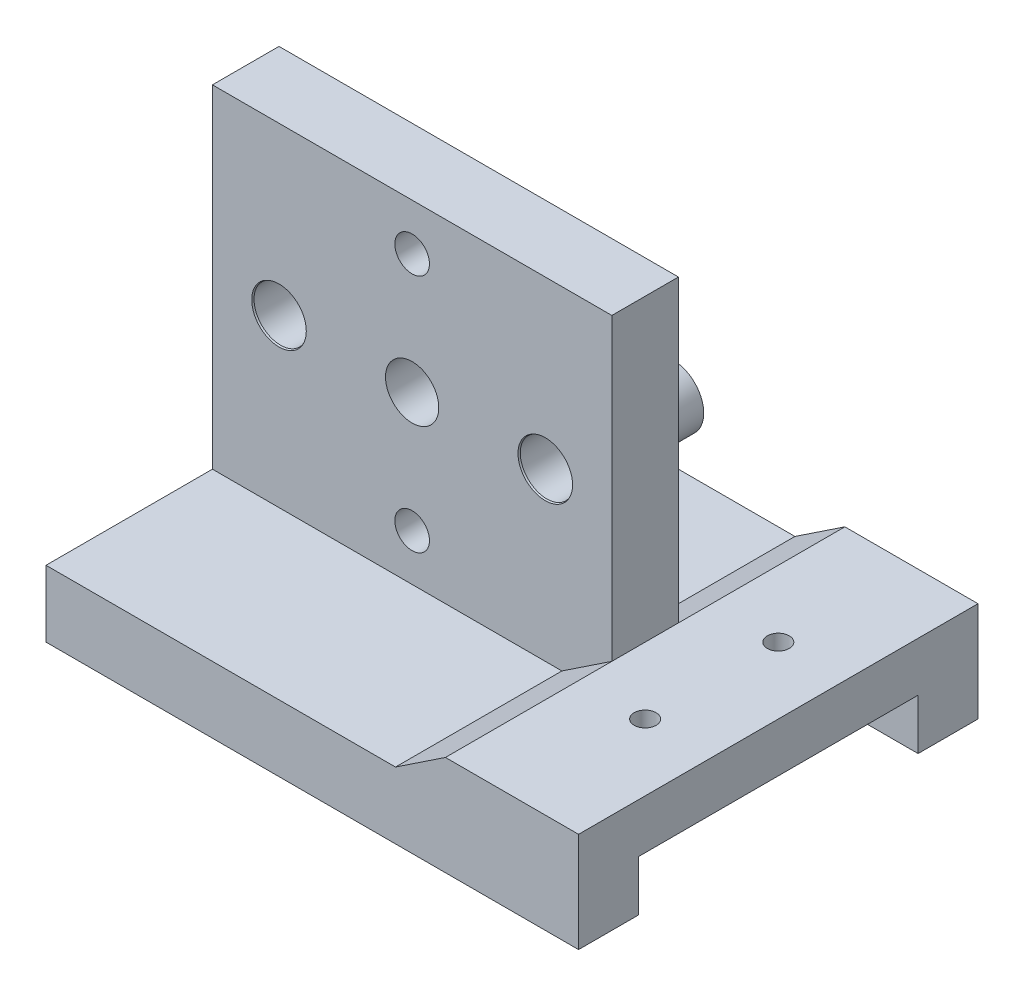
ISO-10303-21;
HEADER;
FILE_DESCRIPTION(('STEP AP214'),'2;1');
FILE_NAME('part.step','',(''),(''),'','','');
FILE_SCHEMA(('AUTOMOTIVE_DESIGN { 1 0 10303 214 1 1 1 1 }'));
ENDSEC;
DATA;
#1=APPLICATION_CONTEXT('core data for automotive mechanical design processes');
#2=APPLICATION_PROTOCOL_DEFINITION('international standard','automotive_design',2000,#1);
#3=PRODUCT_CONTEXT('',#1,'mechanical');
#4=PRODUCT('Part','Part','',(#3));
#5=PRODUCT_RELATED_PRODUCT_CATEGORY('part','',(#4));
#6=PRODUCT_DEFINITION_FORMATION('','',#4);
#7=PRODUCT_DEFINITION_CONTEXT('part definition',#1,'design');
#8=PRODUCT_DEFINITION('design','',#6,#7);
#9=PRODUCT_DEFINITION_SHAPE('','',#8);
#10=(LENGTH_UNIT() NAMED_UNIT(*) SI_UNIT(.MILLI.,.METRE.));
#11=(NAMED_UNIT(*) PLANE_ANGLE_UNIT() SI_UNIT($,.RADIAN.));
#12=(NAMED_UNIT(*) SI_UNIT($,.STERADIAN.) SOLID_ANGLE_UNIT());
#13=UNCERTAINTY_MEASURE_WITH_UNIT(LENGTH_MEASURE(1.E-05),#10,'distance_accuracy_value','');
#14=(GEOMETRIC_REPRESENTATION_CONTEXT(3) GLOBAL_UNCERTAINTY_ASSIGNED_CONTEXT((#13)) GLOBAL_UNIT_ASSIGNED_CONTEXT((#10,
#11,#12)) REPRESENTATION_CONTEXT('',''));
#15=CARTESIAN_POINT('',(0.,0.,0.));
#16=DIRECTION('',(0.,0.,1.));
#17=DIRECTION('',(1.,0.,0.));
#18=AXIS2_PLACEMENT_3D('',#15,#16,#17);
#19=CARTESIAN_POINT('',(0.,0.,0.));
#20=DIRECTION('',(0.,0.,-1.));
#21=DIRECTION('',(-1.,0.,0.));
#22=AXIS2_PLACEMENT_3D('',#19,#20,#21);
#23=PLANE('',#22);
#24=CARTESIAN_POINT('',(20.,0.,0.));
#25=DIRECTION('',(0.,0.,-1.));
#26=DIRECTION('',(-1.,0.,0.));
#27=AXIS2_PLACEMENT_3D('',#24,#25,#26);
#28=CIRCLE('',#27,4.6);
#29=CARTESIAN_POINT('',(15.4,0.,0.));
#30=VERTEX_POINT('',#29);
#31=EDGE_CURVE('E246',#30,#30,#28,.T.);
#32=ORIENTED_EDGE('',*,*,#31,.F.);
#33=EDGE_LOOP('',(#32));
#34=FACE_BOUND('',#33,.T.);
#35=CARTESIAN_POINT('',(0.,0.,0.));
#36=DIRECTION('',(0.,0.,-1.));
#37=DIRECTION('',(-1.,0.,0.));
#38=AXIS2_PLACEMENT_3D('',#35,#36,#37);
#39=CIRCLE('',#38,4.25);
#40=CARTESIAN_POINT('',(-4.25,0.,0.));
#41=VERTEX_POINT('',#40);
#42=EDGE_CURVE('E233',#41,#41,#39,.T.);
#43=ORIENTED_EDGE('',*,*,#42,.F.);
#44=EDGE_LOOP('',(#43));
#45=FACE_BOUND('',#44,.T.);
#46=DIRECTION('',(0.832050294337844,0.554700196225229,0.));
#47=VECTOR('',#46,1.);
#48=CARTESIAN_POINT('',(18.4615384615385,-27.6923076923077,0.));
#49=LINE('',#48,#47);
#50=CARTESIAN_POINT('',(22.4999999999999,-25.,0.));
#51=VERTEX_POINT('',#50);
#52=CARTESIAN_POINT('',(30.,-20.,0.));
#53=VERTEX_POINT('',#52);
#54=EDGE_CURVE('E66',#51,#53,#49,.T.);
#55=ORIENTED_EDGE('',*,*,#54,.F.);
#56=DIRECTION('',(1.,0.,0.));
#57=VECTOR('',#56,1.);
#58=CARTESIAN_POINT('',(-30.,-25.,0.));
#59=LINE('',#58,#57);
#60=CARTESIAN_POINT('',(-30.,-25.,0.));
#61=VERTEX_POINT('',#60);
#62=EDGE_CURVE('E160',#61,#51,#59,.T.);
#63=ORIENTED_EDGE('',*,*,#62,.F.);
#64=DIRECTION('',(0.,-1.,0.));
#65=VECTOR('',#64,1.);
#66=CARTESIAN_POINT('',(-30.,-25.,0.));
#67=LINE('',#66,#65);
#68=CARTESIAN_POINT('',(-30.,25.,0.));
#69=VERTEX_POINT('',#68);
#70=EDGE_CURVE('E329',#69,#61,#67,.T.);
#71=ORIENTED_EDGE('',*,*,#70,.F.);
#72=DIRECTION('',(-1.,0.,0.));
#73=VECTOR('',#72,1.);
#74=CARTESIAN_POINT('',(-30.,25.,0.));
#75=LINE('',#74,#73);
#76=CARTESIAN_POINT('',(30.,25.,0.));
#77=VERTEX_POINT('',#76);
#78=EDGE_CURVE('E324',#77,#69,#75,.T.);
#79=ORIENTED_EDGE('',*,*,#78,.F.);
#80=DIRECTION('',(0.,1.,0.));
#81=VECTOR('',#80,1.);
#82=CARTESIAN_POINT('',(30.,-25.,0.));
#83=LINE('',#82,#81);
#84=EDGE_CURVE('E330',#53,#77,#83,.T.);
#85=ORIENTED_EDGE('',*,*,#84,.F.);
#86=EDGE_LOOP('',(#55,#63,#71,#79,#85));
#87=FACE_BOUND('',#86,.T.);
#88=CARTESIAN_POINT('',(0.,18.,0.));
#89=DIRECTION('',(0.,0.,-1.));
#90=DIRECTION('',(-1.,0.,0.));
#91=AXIS2_PLACEMENT_3D('',#88,#89,#90);
#92=CIRCLE('',#91,2.60000000000001);
#93=CARTESIAN_POINT('',(-2.60000000000001,18.,0.));
#94=VERTEX_POINT('',#93);
#95=EDGE_CURVE('E379',#94,#94,#92,.T.);
#96=ORIENTED_EDGE('',*,*,#95,.F.);
#97=EDGE_LOOP('',(#96));
#98=FACE_BOUND('',#97,.T.);
#99=CARTESIAN_POINT('',(0.,-18.,0.));
#100=DIRECTION('',(0.,0.,-1.));
#101=DIRECTION('',(-1.,0.,0.));
#102=AXIS2_PLACEMENT_3D('',#99,#100,#101);
#103=CIRCLE('',#102,2.60000000000001);
#104=CARTESIAN_POINT('',(-2.60000000000001,-18.,0.));
#105=VERTEX_POINT('',#104);
#106=EDGE_CURVE('E371',#105,#105,#103,.T.);
#107=ORIENTED_EDGE('',*,*,#106,.F.);
#108=EDGE_LOOP('',(#107));
#109=FACE_BOUND('',#108,.T.);
#110=CARTESIAN_POINT('',(-20.,0.,0.));
#111=DIRECTION('',(0.,0.,-1.));
#112=DIRECTION('',(-1.,0.,0.));
#113=AXIS2_PLACEMENT_3D('',#110,#111,#112);
#114=CIRCLE('',#113,4.6);
#115=CARTESIAN_POINT('',(-24.6,0.,0.));
#116=VERTEX_POINT('',#115);
#117=EDGE_CURVE('E262',#116,#116,#114,.T.);
#118=ORIENTED_EDGE('',*,*,#117,.F.);
#119=EDGE_LOOP('',(#118));
#120=FACE_BOUND('',#119,.T.);
#121=ADVANCED_FACE('F41',(#34,#45,#87,#98,#109,#120),#23,.T.);
#122=CARTESIAN_POINT('',(30.,-25.,10.));
#123=DIRECTION('',(-1.,0.,0.));
#124=DIRECTION('',(0.,0.,1.));
#125=AXIS2_PLACEMENT_3D('',#122,#123,#124);
#126=PLANE('',#125);
#127=DIRECTION('',(0.,0.,-1.));
#128=VECTOR('',#127,1.);
#129=CARTESIAN_POINT('',(30.,-20.,35.));
#130=LINE('',#129,#128);
#131=CARTESIAN_POINT('',(30.,-20.,10.));
#132=VERTEX_POINT('',#131);
#133=EDGE_CURVE('E154',#132,#53,#130,.T.);
#134=ORIENTED_EDGE('',*,*,#133,.T.);
#135=ORIENTED_EDGE('',*,*,#84,.T.);
#136=DIRECTION('',(0.,0.,-1.));
#137=VECTOR('',#136,1.);
#138=CARTESIAN_POINT('',(30.,25.,10.));
#139=LINE('',#138,#137);
#140=CARTESIAN_POINT('',(30.,25.,10.));
#141=VERTEX_POINT('',#140);
#142=EDGE_CURVE('E11',#141,#77,#139,.T.);
#143=ORIENTED_EDGE('',*,*,#142,.F.);
#144=DIRECTION('',(0.,1.,0.));
#145=VECTOR('',#144,1.);
#146=CARTESIAN_POINT('',(30.,-25.,10.));
#147=LINE('',#146,#145);
#148=EDGE_CURVE('E152',#132,#141,#147,.T.);
#149=ORIENTED_EDGE('',*,*,#148,.F.);
#150=EDGE_LOOP('',(#134,#135,#143,#149));
#151=FACE_BOUND('',#150,.T.);
#152=ADVANCED_FACE('F43',(#151),#126,.F.);
#153=CARTESIAN_POINT('',(0.,-25.,0.));
#154=DIRECTION('',(0.,1.,0.));
#155=DIRECTION('',(0.,0.,1.));
#156=AXIS2_PLACEMENT_3D('',#153,#154,#155);
#157=PLANE('',#156);
#158=DIRECTION('',(0.,0.,1.));
#159=VECTOR('',#158,1.);
#160=CARTESIAN_POINT('',(22.5,-25.,-25.));
#161=LINE('',#160,#159);
#162=CARTESIAN_POINT('',(22.4999999999999,-25.,10.));
#163=VERTEX_POINT('',#162);
#164=CARTESIAN_POINT('',(22.5,-25.,35.));
#165=VERTEX_POINT('',#164);
#166=EDGE_CURVE('E58',#163,#165,#161,.T.);
#167=ORIENTED_EDGE('',*,*,#166,.F.);
#168=DIRECTION('',(1.,0.,0.));
#169=VECTOR('',#168,1.);
#170=CARTESIAN_POINT('',(-30.,-25.,10.));
#171=LINE('',#170,#169);
#172=CARTESIAN_POINT('',(-30.,-25.,10.));
#173=VERTEX_POINT('',#172);
#174=EDGE_CURVE('E177',#173,#163,#171,.T.);
#175=ORIENTED_EDGE('',*,*,#174,.F.);
#176=DIRECTION('',(0.,0.,-1.));
#177=VECTOR('',#176,1.);
#178=CARTESIAN_POINT('',(-30.,-25.,-25.));
#179=LINE('',#178,#177);
#180=CARTESIAN_POINT('',(-30.,-25.,35.));
#181=VERTEX_POINT('',#180);
#182=EDGE_CURVE('E403',#181,#173,#179,.T.);
#183=ORIENTED_EDGE('',*,*,#182,.F.);
#184=DIRECTION('',(-1.,0.,0.));
#185=VECTOR('',#184,1.);
#186=CARTESIAN_POINT('',(-30.,-25.,35.));
#187=LINE('',#186,#185);
#188=EDGE_CURVE('E407',#165,#181,#187,.T.);
#189=ORIENTED_EDGE('',*,*,#188,.F.);
#190=EDGE_LOOP('',(#167,#175,#183,#189));
#191=FACE_BOUND('',#190,.T.);
#192=ADVANCED_FACE('F303',(#191),#157,.T.);
#193=CARTESIAN_POINT('',(22.5,-25.,-25.));
#194=VERTEX_POINT('',#193);
#195=EDGE_CURVE('E220',#194,#51,#161,.T.);
#196=ORIENTED_EDGE('',*,*,#195,.F.);
#197=DIRECTION('',(1.,0.,0.));
#198=VECTOR('',#197,1.);
#199=CARTESIAN_POINT('',(-30.,-25.,-25.));
#200=LINE('',#199,#198);
#201=CARTESIAN_POINT('',(-30.,-25.,-25.));
#202=VERTEX_POINT('',#201);
#203=EDGE_CURVE('E398',#202,#194,#200,.T.);
#204=ORIENTED_EDGE('',*,*,#203,.F.);
#205=EDGE_CURVE('E406',#61,#202,#179,.T.);
#206=ORIENTED_EDGE('',*,*,#205,.F.);
#207=ORIENTED_EDGE('',*,*,#62,.T.);
#208=EDGE_LOOP('',(#196,#204,#206,#207));
#209=FACE_BOUND('',#208,.T.);
#210=ADVANCED_FACE('F488',(#209),#157,.T.);
#211=CARTESIAN_POINT('',(50.,-35.,-25.));
#212=DIRECTION('',(-1.,0.,0.));
#213=DIRECTION('',(0.,0.,1.));
#214=AXIS2_PLACEMENT_3D('',#211,#212,#213);
#215=PLANE('',#214);
#216=DIRECTION('',(0.,1.,0.));
#217=VECTOR('',#216,1.);
#218=CARTESIAN_POINT('',(50.,-35.,-16.));
#219=LINE('',#218,#217);
#220=CARTESIAN_POINT('',(50.,-35.,-16.));
#221=VERTEX_POINT('',#220);
#222=CARTESIAN_POINT('',(50.,-27.4,-16.));
#223=VERTEX_POINT('',#222);
#224=EDGE_CURVE('E437',#221,#223,#219,.T.);
#225=ORIENTED_EDGE('',*,*,#224,.F.);
#226=DIRECTION('',(0.,0.,1.));
#227=VECTOR('',#226,1.);
#228=CARTESIAN_POINT('',(50.,-35.,-25.));
#229=LINE('',#228,#227);
#230=CARTESIAN_POINT('',(50.,-35.,-25.));
#231=VERTEX_POINT('',#230);
#232=EDGE_CURVE('E419',#231,#221,#229,.T.);
#233=ORIENTED_EDGE('',*,*,#232,.F.);
#234=DIRECTION('',(0.,1.,0.));
#235=VECTOR('',#234,1.);
#236=CARTESIAN_POINT('',(50.,-35.,-25.));
#237=LINE('',#236,#235);
#238=CARTESIAN_POINT('',(50.,-20.,-25.));
#239=VERTEX_POINT('',#238);
#240=EDGE_CURVE('E394',#231,#239,#237,.T.);
#241=ORIENTED_EDGE('',*,*,#240,.T.);
#242=DIRECTION('',(0.,0.,-1.));
#243=VECTOR('',#242,1.);
#244=CARTESIAN_POINT('',(50.,-20.,35.));
#245=LINE('',#244,#243);
#246=CARTESIAN_POINT('',(50.,-20.,35.));
#247=VERTEX_POINT('',#246);
#248=EDGE_CURVE('E186',#247,#239,#245,.T.);
#249=ORIENTED_EDGE('',*,*,#248,.F.);
#250=DIRECTION('',(0.,1.,0.));
#251=VECTOR('',#250,1.);
#252=CARTESIAN_POINT('',(50.,-35.,35.));
#253=LINE('',#252,#251);
#254=CARTESIAN_POINT('',(50.,-35.,35.));
#255=VERTEX_POINT('',#254);
#256=EDGE_CURVE('E383',#255,#247,#253,.T.);
#257=ORIENTED_EDGE('',*,*,#256,.F.);
#258=CARTESIAN_POINT('',(50.,-35.,26.));
#259=VERTEX_POINT('',#258);
#260=EDGE_CURVE('E402',#259,#255,#229,.T.);
#261=ORIENTED_EDGE('',*,*,#260,.F.);
#262=DIRECTION('',(0.,1.,0.));
#263=VECTOR('',#262,1.);
#264=CARTESIAN_POINT('',(50.,-35.,26.));
#265=LINE('',#264,#263);
#266=CARTESIAN_POINT('',(50.,-27.4,26.));
#267=VERTEX_POINT('',#266);
#268=EDGE_CURVE('E189',#259,#267,#265,.T.);
#269=ORIENTED_EDGE('',*,*,#268,.T.);
#270=DIRECTION('',(0.,0.,1.));
#271=VECTOR('',#270,1.);
#272=CARTESIAN_POINT('',(50.,-27.4,-16.));
#273=LINE('',#272,#271);
#274=EDGE_CURVE('E423',#223,#267,#273,.T.);
#275=ORIENTED_EDGE('',*,*,#274,.F.);
#276=EDGE_LOOP('',(#225,#233,#241,#249,#257,#261,#269,#275));
#277=FACE_BOUND('',#276,.T.);
#278=ADVANCED_FACE('F319',(#277),#215,.F.);
#279=CARTESIAN_POINT('',(0.,-35.,0.));
#280=DIRECTION('',(0.,1.,0.));
#281=DIRECTION('',(0.,0.,1.));
#282=AXIS2_PLACEMENT_3D('',#279,#280,#281);
#283=PLANE('',#282);
#284=DIRECTION('',(1.,0.,0.));
#285=VECTOR('',#284,1.);
#286=CARTESIAN_POINT('',(50.,-35.,-16.));
#287=LINE('',#286,#285);
#288=CARTESIAN_POINT('',(30.,-35.,-16.));
#289=VERTEX_POINT('',#288);
#290=EDGE_CURVE('E427',#289,#221,#287,.T.);
#291=ORIENTED_EDGE('',*,*,#290,.F.);
#292=DIRECTION('',(0.,0.,1.));
#293=VECTOR('',#292,1.);
#294=CARTESIAN_POINT('',(30.,-35.,-16.));
#295=LINE('',#294,#293);
#296=CARTESIAN_POINT('',(30.,-35.,26.));
#297=VERTEX_POINT('',#296);
#298=EDGE_CURVE('E410',#289,#297,#295,.T.);
#299=ORIENTED_EDGE('',*,*,#298,.T.);
#300=DIRECTION('',(1.,0.,0.));
#301=VECTOR('',#300,1.);
#302=CARTESIAN_POINT('',(50.,-35.,26.));
#303=LINE('',#302,#301);
#304=EDGE_CURVE('E433',#297,#259,#303,.T.);
#305=ORIENTED_EDGE('',*,*,#304,.T.);
#306=ORIENTED_EDGE('',*,*,#260,.T.);
#307=DIRECTION('',(-1.,0.,0.));
#308=VECTOR('',#307,1.);
#309=CARTESIAN_POINT('',(-30.,-35.,35.));
#310=LINE('',#309,#308);
#311=CARTESIAN_POINT('',(-30.,-35.,35.));
#312=VERTEX_POINT('',#311);
#313=EDGE_CURVE('E416',#255,#312,#310,.T.);
#314=ORIENTED_EDGE('',*,*,#313,.T.);
#315=DIRECTION('',(0.,0.,-1.));
#316=VECTOR('',#315,1.);
#317=CARTESIAN_POINT('',(-30.,-35.,-25.));
#318=LINE('',#317,#316);
#319=CARTESIAN_POINT('',(-30.,-35.,-25.));
#320=VERTEX_POINT('',#319);
#321=EDGE_CURVE('E413',#312,#320,#318,.T.);
#322=ORIENTED_EDGE('',*,*,#321,.T.);
#323=DIRECTION('',(1.,0.,0.));
#324=VECTOR('',#323,1.);
#325=CARTESIAN_POINT('',(-30.,-35.,-25.));
#326=LINE('',#325,#324);
#327=EDGE_CURVE('E397',#320,#231,#326,.T.);
#328=ORIENTED_EDGE('',*,*,#327,.T.);
#329=ORIENTED_EDGE('',*,*,#232,.T.);
#330=EDGE_LOOP('',(#291,#299,#305,#306,#314,#322,#328,#329));
#331=FACE_BOUND('',#330,.T.);
#332=ADVANCED_FACE('F314',(#331),#283,.F.);
#333=CARTESIAN_POINT('',(-30.,25.,10.));
#334=DIRECTION('',(0.,-1.,0.));
#335=DIRECTION('',(0.,0.,-1.));
#336=AXIS2_PLACEMENT_3D('',#333,#334,#335);
#337=PLANE('',#336);
#338=ORIENTED_EDGE('',*,*,#78,.T.);
#339=DIRECTION('',(0.,0.,-1.));
#340=VECTOR('',#339,1.);
#341=CARTESIAN_POINT('',(-30.,25.,10.));
#342=LINE('',#341,#340);
#343=CARTESIAN_POINT('',(-30.,25.,10.));
#344=VERTEX_POINT('',#343);
#345=EDGE_CURVE('E51',#344,#69,#342,.T.);
#346=ORIENTED_EDGE('',*,*,#345,.F.);
#347=DIRECTION('',(-1.,0.,0.));
#348=VECTOR('',#347,1.);
#349=CARTESIAN_POINT('',(-30.,25.,10.));
#350=LINE('',#349,#348);
#351=EDGE_CURVE('E159',#141,#344,#350,.T.);
#352=ORIENTED_EDGE('',*,*,#351,.F.);
#353=ORIENTED_EDGE('',*,*,#142,.T.);
#354=EDGE_LOOP('',(#338,#346,#352,#353));
#355=FACE_BOUND('',#354,.T.);
#356=ADVANCED_FACE('F311',(#355),#337,.F.);
#357=CARTESIAN_POINT('',(-30.,-25.,10.));
#358=DIRECTION('',(1.,0.,0.));
#359=DIRECTION('',(0.,0.,-1.));
#360=AXIS2_PLACEMENT_3D('',#357,#358,#359);
#361=PLANE('',#360);
#362=ORIENTED_EDGE('',*,*,#70,.T.);
#363=ORIENTED_EDGE('',*,*,#205,.T.);
#364=DIRECTION('',(0.,1.,0.));
#365=VECTOR('',#364,1.);
#366=CARTESIAN_POINT('',(-30.,-35.,-25.));
#367=LINE('',#366,#365);
#368=EDGE_CURVE('E390',#320,#202,#367,.T.);
#369=ORIENTED_EDGE('',*,*,#368,.F.);
#370=ORIENTED_EDGE('',*,*,#321,.F.);
#371=DIRECTION('',(0.,1.,0.));
#372=VECTOR('',#371,1.);
#373=CARTESIAN_POINT('',(-30.,-35.,35.));
#374=LINE('',#373,#372);
#375=EDGE_CURVE('E386',#312,#181,#374,.T.);
#376=ORIENTED_EDGE('',*,*,#375,.T.);
#377=ORIENTED_EDGE('',*,*,#182,.T.);
#378=DIRECTION('',(0.,-1.,0.));
#379=VECTOR('',#378,1.);
#380=CARTESIAN_POINT('',(-30.,-25.,10.));
#381=LINE('',#380,#379);
#382=EDGE_CURVE('E334',#344,#173,#381,.T.);
#383=ORIENTED_EDGE('',*,*,#382,.F.);
#384=ORIENTED_EDGE('',*,*,#345,.T.);
#385=EDGE_LOOP('',(#362,#363,#369,#370,#376,#377,#383,#384));
#386=FACE_BOUND('',#385,.T.);
#387=ADVANCED_FACE('F309',(#386),#361,.F.);
#388=CARTESIAN_POINT('',(0.,0.,10.));
#389=DIRECTION('',(0.,0.,-1.));
#390=DIRECTION('',(-1.,0.,0.));
#391=AXIS2_PLACEMENT_3D('',#388,#389,#390);
#392=PLANE('',#391);
#393=CARTESIAN_POINT('',(0.,0.,10.));
#394=DIRECTION('',(0.,0.,-1.));
#395=DIRECTION('',(-1.,0.,0.));
#396=AXIS2_PLACEMENT_3D('',#393,#394,#395);
#397=CIRCLE('',#396,4.);
#398=CARTESIAN_POINT('',(-4.,0.,10.));
#399=VERTEX_POINT('',#398);
#400=EDGE_CURVE('E45',#399,#399,#397,.T.);
#401=ORIENTED_EDGE('',*,*,#400,.T.);
#402=EDGE_LOOP('',(#401));
#403=FACE_BOUND('',#402,.T.);
#404=CARTESIAN_POINT('',(0.,18.,10.));
#405=DIRECTION('',(0.,0.,-1.));
#406=DIRECTION('',(-1.,0.,0.));
#407=AXIS2_PLACEMENT_3D('',#404,#405,#406);
#408=CIRCLE('',#407,2.60000000000001);
#409=CARTESIAN_POINT('',(-2.60000000000001,18.,10.));
#410=VERTEX_POINT('',#409);
#411=EDGE_CURVE('E375',#410,#410,#408,.T.);
#412=ORIENTED_EDGE('',*,*,#411,.T.);
#413=EDGE_LOOP('',(#412));
#414=FACE_BOUND('',#413,.T.);
#415=CARTESIAN_POINT('',(0.,-18.,10.));
#416=DIRECTION('',(0.,0.,-1.));
#417=DIRECTION('',(-1.,0.,0.));
#418=AXIS2_PLACEMENT_3D('',#415,#416,#417);
#419=CIRCLE('',#418,2.60000000000001);
#420=CARTESIAN_POINT('',(-2.60000000000001,-18.,10.));
#421=VERTEX_POINT('',#420);
#422=EDGE_CURVE('E367',#421,#421,#419,.T.);
#423=ORIENTED_EDGE('',*,*,#422,.T.);
#424=EDGE_LOOP('',(#423));
#425=FACE_BOUND('',#424,.T.);
#426=CARTESIAN_POINT('',(20.,0.,10.));
#427=DIRECTION('',(0.,0.,1.));
#428=DIRECTION('',(1.,0.,0.));
#429=AXIS2_PLACEMENT_3D('',#426,#427,#428);
#430=CIRCLE('',#429,4.1);
#431=CARTESIAN_POINT('',(24.1,0.,10.));
#432=VERTEX_POINT('',#431);
#433=EDGE_CURVE('E363',#432,#432,#430,.T.);
#434=ORIENTED_EDGE('',*,*,#433,.F.);
#435=EDGE_LOOP('',(#434));
#436=FACE_BOUND('',#435,.T.);
#437=CARTESIAN_POINT('',(-20.,0.,10.));
#438=DIRECTION('',(0.,0.,1.));
#439=DIRECTION('',(1.,0.,0.));
#440=AXIS2_PLACEMENT_3D('',#437,#438,#439);
#441=CIRCLE('',#440,4.1);
#442=CARTESIAN_POINT('',(-15.9,0.,10.));
#443=VERTEX_POINT('',#442);
#444=EDGE_CURVE('E355',#443,#443,#441,.T.);
#445=ORIENTED_EDGE('',*,*,#444,.F.);
#446=EDGE_LOOP('',(#445));
#447=FACE_BOUND('',#446,.T.);
#448=ORIENTED_EDGE('',*,*,#174,.T.);
#449=DIRECTION('',(0.832050294337844,0.554700196225229,0.));
#450=VECTOR('',#449,1.);
#451=CARTESIAN_POINT('',(18.4615384615385,-27.6923076923077,10.));
#452=LINE('',#451,#450);
#453=EDGE_CURVE('E174',#163,#132,#452,.T.);
#454=ORIENTED_EDGE('',*,*,#453,.T.);
#455=ORIENTED_EDGE('',*,*,#148,.T.);
#456=ORIENTED_EDGE('',*,*,#351,.T.);
#457=ORIENTED_EDGE('',*,*,#382,.T.);
#458=EDGE_LOOP('',(#448,#454,#455,#456,#457));
#459=FACE_BOUND('',#458,.T.);
#460=ADVANCED_FACE('F175',(#403,#414,#425,#436,#447,#459),#392,.F.);
#461=CARTESIAN_POINT('',(-20.,0.,10.));
#462=DIRECTION('',(0.,0.,1.));
#463=DIRECTION('',(1.,0.,0.));
#464=AXIS2_PLACEMENT_3D('',#461,#462,#463);
#465=CYLINDRICAL_SURFACE('',#464,4.00000000000001);
#466=CARTESIAN_POINT('',(-20.,0.,0.241421356237288));
#467=DIRECTION('',(0.,0.,-1.));
#468=DIRECTION('',(-1.,0.,0.));
#469=AXIS2_PLACEMENT_3D('',#466,#467,#468);
#470=CIRCLE('',#469,4.);
#471=CARTESIAN_POINT('',(-24.,0.,0.241421356237288));
#472=VERTEX_POINT('',#471);
#473=EDGE_CURVE('E237',#472,#472,#470,.T.);
#474=ORIENTED_EDGE('',*,*,#473,.T.);
#475=EDGE_LOOP('',(#474));
#476=FACE_BOUND('',#475,.T.);
#477=CARTESIAN_POINT('',(-20.,0.,9.75857864376273));
#478=DIRECTION('',(0.,0.,1.));
#479=DIRECTION('',(1.,0.,0.));
#480=AXIS2_PLACEMENT_3D('',#477,#478,#479);
#481=CIRCLE('',#480,4.00000000000001);
#482=CARTESIAN_POINT('',(-16.,0.,9.75857864376273));
#483=VERTEX_POINT('',#482);
#484=EDGE_CURVE('E345',#483,#483,#481,.T.);
#485=ORIENTED_EDGE('',*,*,#484,.T.);
#486=EDGE_LOOP('',(#485));
#487=FACE_BOUND('',#486,.T.);
#488=ADVANCED_FACE('F566',(#476,#487),#465,.F.);
#489=CARTESIAN_POINT('',(-20.,0.,10.));
#490=DIRECTION('',(0.,0.,1.));
#491=DIRECTION('',(1.,0.,0.));
#492=AXIS2_PLACEMENT_3D('',#489,#490,#491);
#493=CONICAL_SURFACE('',#492,4.1,0.392699081698732);
#494=ORIENTED_EDGE('',*,*,#484,.F.);
#495=EDGE_LOOP('',(#494));
#496=FACE_BOUND('',#495,.T.);
#497=ORIENTED_EDGE('',*,*,#444,.T.);
#498=EDGE_LOOP('',(#497));
#499=FACE_BOUND('',#498,.T.);
#500=ADVANCED_FACE('F563',(#496,#499),#493,.F.);
#501=CARTESIAN_POINT('',(20.,0.,10.));
#502=DIRECTION('',(0.,0.,1.));
#503=DIRECTION('',(1.,0.,0.));
#504=AXIS2_PLACEMENT_3D('',#501,#502,#503);
#505=CYLINDRICAL_SURFACE('',#504,4.00000000000001);
#506=CARTESIAN_POINT('',(20.,0.,0.241421356237288));
#507=DIRECTION('',(0.,0.,-1.));
#508=DIRECTION('',(-1.,0.,0.));
#509=AXIS2_PLACEMENT_3D('',#506,#507,#508);
#510=CIRCLE('',#509,4.);
#511=CARTESIAN_POINT('',(16.,0.,0.241421356237288));
#512=VERTEX_POINT('',#511);
#513=EDGE_CURVE('E241',#512,#512,#510,.T.);
#514=ORIENTED_EDGE('',*,*,#513,.T.);
#515=EDGE_LOOP('',(#514));
#516=FACE_BOUND('',#515,.T.);
#517=CARTESIAN_POINT('',(20.,0.,9.75857864376273));
#518=DIRECTION('',(0.,0.,1.));
#519=DIRECTION('',(1.,0.,0.));
#520=AXIS2_PLACEMENT_3D('',#517,#518,#519);
#521=CIRCLE('',#520,4.00000000000001);
#522=CARTESIAN_POINT('',(24.,0.,9.75857864376273));
#523=VERTEX_POINT('',#522);
#524=EDGE_CURVE('E359',#523,#523,#521,.T.);
#525=ORIENTED_EDGE('',*,*,#524,.T.);
#526=EDGE_LOOP('',(#525));
#527=FACE_BOUND('',#526,.T.);
#528=ADVANCED_FACE('F559',(#516,#527),#505,.F.);
#529=CARTESIAN_POINT('',(20.,0.,10.));
#530=DIRECTION('',(0.,0.,1.));
#531=DIRECTION('',(1.,0.,0.));
#532=AXIS2_PLACEMENT_3D('',#529,#530,#531);
#533=CONICAL_SURFACE('',#532,4.1,0.392699081698732);
#534=ORIENTED_EDGE('',*,*,#524,.F.);
#535=EDGE_LOOP('',(#534));
#536=FACE_BOUND('',#535,.T.);
#537=ORIENTED_EDGE('',*,*,#433,.T.);
#538=EDGE_LOOP('',(#537));
#539=FACE_BOUND('',#538,.T.);
#540=ADVANCED_FACE('F555',(#536,#539),#533,.F.);
#541=CARTESIAN_POINT('',(0.,-18.,0.));
#542=DIRECTION('',(0.,0.,-1.));
#543=DIRECTION('',(-1.,0.,0.));
#544=AXIS2_PLACEMENT_3D('',#541,#542,#543);
#545=CYLINDRICAL_SURFACE('',#544,2.60000000000001);
#546=ORIENTED_EDGE('',*,*,#422,.F.);
#547=EDGE_LOOP('',(#546));
#548=FACE_BOUND('',#547,.T.);
#549=ORIENTED_EDGE('',*,*,#106,.T.);
#550=EDGE_LOOP('',(#549));
#551=FACE_BOUND('',#550,.T.);
#552=ADVANCED_FACE('F551',(#548,#551),#545,.F.);
#553=CARTESIAN_POINT('',(0.,18.,0.));
#554=DIRECTION('',(0.,0.,-1.));
#555=DIRECTION('',(-1.,0.,0.));
#556=AXIS2_PLACEMENT_3D('',#553,#554,#555);
#557=CYLINDRICAL_SURFACE('',#556,2.60000000000001);
#558=ORIENTED_EDGE('',*,*,#411,.F.);
#559=EDGE_LOOP('',(#558));
#560=FACE_BOUND('',#559,.T.);
#561=ORIENTED_EDGE('',*,*,#95,.T.);
#562=EDGE_LOOP('',(#561));
#563=FACE_BOUND('',#562,.T.);
#564=ADVANCED_FACE('F546',(#560,#563),#557,.F.);
#565=CARTESIAN_POINT('',(-30.,-35.,35.));
#566=DIRECTION('',(0.,0.,-1.));
#567=DIRECTION('',(-1.,0.,0.));
#568=AXIS2_PLACEMENT_3D('',#565,#566,#567);
#569=PLANE('',#568);
#570=DIRECTION('',(-0.832050294337844,-0.554700196225229,0.));
#571=VECTOR('',#570,1.);
#572=CARTESIAN_POINT('',(30.,-20.,35.));
#573=LINE('',#572,#571);
#574=CARTESIAN_POINT('',(30.,-20.,35.));
#575=VERTEX_POINT('',#574);
#576=EDGE_CURVE('E184',#575,#165,#573,.T.);
#577=ORIENTED_EDGE('',*,*,#576,.T.);
#578=ORIENTED_EDGE('',*,*,#188,.T.);
#579=ORIENTED_EDGE('',*,*,#375,.F.);
#580=ORIENTED_EDGE('',*,*,#313,.F.);
#581=ORIENTED_EDGE('',*,*,#256,.T.);
#582=DIRECTION('',(-1.,0.,0.));
#583=VECTOR('',#582,1.);
#584=CARTESIAN_POINT('',(50.,-20.,35.));
#585=LINE('',#584,#583);
#586=EDGE_CURVE('E193',#247,#575,#585,.T.);
#587=ORIENTED_EDGE('',*,*,#586,.T.);
#588=EDGE_LOOP('',(#577,#578,#579,#580,#581,#587));
#589=FACE_BOUND('',#588,.T.);
#590=ADVANCED_FACE('F494',(#589),#569,.F.);
#591=CARTESIAN_POINT('',(-30.,-35.,-25.));
#592=DIRECTION('',(0.,0.,1.));
#593=DIRECTION('',(1.,0.,0.));
#594=AXIS2_PLACEMENT_3D('',#591,#592,#593);
#595=PLANE('',#594);
#596=ORIENTED_EDGE('',*,*,#203,.T.);
#597=DIRECTION('',(-0.832050294337844,-0.554700196225229,0.));
#598=VECTOR('',#597,1.);
#599=CARTESIAN_POINT('',(30.,-20.,-25.));
#600=LINE('',#599,#598);
#601=CARTESIAN_POINT('',(30.,-20.,-25.));
#602=VERTEX_POINT('',#601);
#603=EDGE_CURVE('E226',#602,#194,#600,.T.);
#604=ORIENTED_EDGE('',*,*,#603,.F.);
#605=DIRECTION('',(-1.,0.,0.));
#606=VECTOR('',#605,1.);
#607=CARTESIAN_POINT('',(50.,-20.,-25.));
#608=LINE('',#607,#606);
#609=EDGE_CURVE('E198',#239,#602,#608,.T.);
#610=ORIENTED_EDGE('',*,*,#609,.F.);
#611=ORIENTED_EDGE('',*,*,#240,.F.);
#612=ORIENTED_EDGE('',*,*,#327,.F.);
#613=ORIENTED_EDGE('',*,*,#368,.T.);
#614=EDGE_LOOP('',(#596,#604,#610,#611,#612,#613));
#615=FACE_BOUND('',#614,.T.);
#616=ADVANCED_FACE('F484',(#615),#595,.F.);
#617=CARTESIAN_POINT('',(30.,-35.,-16.));
#618=DIRECTION('',(-1.,0.,0.));
#619=DIRECTION('',(0.,0.,1.));
#620=AXIS2_PLACEMENT_3D('',#617,#618,#619);
#621=PLANE('',#620);
#622=DIRECTION('',(0.,-1.,0.));
#623=VECTOR('',#622,1.);
#624=CARTESIAN_POINT('',(30.,-35.,26.));
#625=LINE('',#624,#623);
#626=CARTESIAN_POINT('',(30.,-27.4,26.));
#627=VERTEX_POINT('',#626);
#628=EDGE_CURVE('E438',#627,#297,#625,.T.);
#629=ORIENTED_EDGE('',*,*,#628,.T.);
#630=ORIENTED_EDGE('',*,*,#298,.F.);
#631=DIRECTION('',(0.,-1.,0.));
#632=VECTOR('',#631,1.);
#633=CARTESIAN_POINT('',(30.,-35.,-16.));
#634=LINE('',#633,#632);
#635=CARTESIAN_POINT('',(30.,-27.4,-16.));
#636=VERTEX_POINT('',#635);
#637=EDGE_CURVE('E450',#636,#289,#634,.T.);
#638=ORIENTED_EDGE('',*,*,#637,.F.);
#639=DIRECTION('',(0.,0.,1.));
#640=VECTOR('',#639,1.);
#641=CARTESIAN_POINT('',(30.,-27.4,-16.));
#642=LINE('',#641,#640);
#643=EDGE_CURVE('E426',#636,#627,#642,.T.);
#644=ORIENTED_EDGE('',*,*,#643,.T.);
#645=EDGE_LOOP('',(#629,#630,#638,#644));
#646=FACE_BOUND('',#645,.T.);
#647=ADVANCED_FACE('F476',(#646),#621,.F.);
#648=CARTESIAN_POINT('',(50.,-27.4,-16.));
#649=DIRECTION('',(0.,1.,0.));
#650=DIRECTION('',(-1.,0.,0.));
#651=AXIS2_PLACEMENT_3D('',#648,#649,#650);
#652=PLANE('',#651);
#653=CARTESIAN_POINT('',(40.,-27.4,15.));
#654=DIRECTION('',(0.,1.,0.));
#655=DIRECTION('',(-1.,0.,0.));
#656=AXIS2_PLACEMENT_3D('',#653,#654,#655);
#657=CIRCLE('',#656,1.65000000000001);
#658=CARTESIAN_POINT('',(38.35,-27.4,15.));
#659=VERTEX_POINT('',#658);
#660=EDGE_CURVE('E211',#659,#659,#657,.T.);
#661=ORIENTED_EDGE('',*,*,#660,.T.);
#662=EDGE_LOOP('',(#661));
#663=FACE_BOUND('',#662,.T.);
#664=CARTESIAN_POINT('',(40.,-27.4,-5.00000000000001));
#665=DIRECTION('',(0.,1.,0.));
#666=DIRECTION('',(-1.,0.,0.));
#667=AXIS2_PLACEMENT_3D('',#664,#665,#666);
#668=CIRCLE('',#667,1.65000000000001);
#669=CARTESIAN_POINT('',(38.35,-27.4,-5.00000000000001));
#670=VERTEX_POINT('',#669);
#671=EDGE_CURVE('E202',#670,#670,#668,.T.);
#672=ORIENTED_EDGE('',*,*,#671,.T.);
#673=EDGE_LOOP('',(#672));
#674=FACE_BOUND('',#673,.T.);
#675=DIRECTION('',(-1.,0.,0.));
#676=VECTOR('',#675,1.);
#677=CARTESIAN_POINT('',(50.,-27.4,26.));
#678=LINE('',#677,#676);
#679=EDGE_CURVE('E441',#267,#627,#678,.T.);
#680=ORIENTED_EDGE('',*,*,#679,.T.);
#681=ORIENTED_EDGE('',*,*,#643,.F.);
#682=DIRECTION('',(-1.,0.,0.));
#683=VECTOR('',#682,1.);
#684=CARTESIAN_POINT('',(50.,-27.4,-16.));
#685=LINE('',#684,#683);
#686=EDGE_CURVE('E454',#223,#636,#685,.T.);
#687=ORIENTED_EDGE('',*,*,#686,.F.);
#688=ORIENTED_EDGE('',*,*,#274,.T.);
#689=EDGE_LOOP('',(#680,#681,#687,#688));
#690=FACE_BOUND('',#689,.T.);
#691=ADVANCED_FACE('F470',(#663,#674,#690),#652,.F.);
#692=CARTESIAN_POINT('',(0.,0.,-16.));
#693=DIRECTION('',(0.,0.,1.));
#694=DIRECTION('',(1.,0.,0.));
#695=AXIS2_PLACEMENT_3D('',#692,#693,#694);
#696=PLANE('',#695);
#697=ORIENTED_EDGE('',*,*,#224,.T.);
#698=ORIENTED_EDGE('',*,*,#686,.T.);
#699=ORIENTED_EDGE('',*,*,#637,.T.);
#700=ORIENTED_EDGE('',*,*,#290,.T.);
#701=EDGE_LOOP('',(#697,#698,#699,#700));
#702=FACE_BOUND('',#701,.T.);
#703=ADVANCED_FACE('F463',(#702),#696,.T.);
#704=CARTESIAN_POINT('',(0.,0.,26.));
#705=DIRECTION('',(0.,0.,1.));
#706=DIRECTION('',(1.,0.,0.));
#707=AXIS2_PLACEMENT_3D('',#704,#705,#706);
#708=PLANE('',#707);
#709=ORIENTED_EDGE('',*,*,#268,.F.);
#710=ORIENTED_EDGE('',*,*,#304,.F.);
#711=ORIENTED_EDGE('',*,*,#628,.F.);
#712=ORIENTED_EDGE('',*,*,#679,.F.);
#713=EDGE_LOOP('',(#709,#710,#711,#712));
#714=FACE_BOUND('',#713,.T.);
#715=ADVANCED_FACE('F473',(#714),#708,.F.);
#716=CARTESIAN_POINT('',(50.,-20.,35.));
#717=DIRECTION('',(0.,-1.,0.));
#718=DIRECTION('',(1.,0.,0.));
#719=AXIS2_PLACEMENT_3D('',#716,#717,#718);
#720=PLANE('',#719);
#721=CARTESIAN_POINT('',(40.,-20.,15.));
#722=DIRECTION('',(0.,1.,0.));
#723=DIRECTION('',(0.,0.,1.));
#724=AXIS2_PLACEMENT_3D('',#721,#722,#723);
#725=CIRCLE('',#724,1.65000000000001);
#726=CARTESIAN_POINT('',(40.,-20.,16.65));
#727=VERTEX_POINT('',#726);
#728=EDGE_CURVE('E180',#727,#727,#725,.T.);
#729=ORIENTED_EDGE('',*,*,#728,.F.);
#730=EDGE_LOOP('',(#729));
#731=FACE_BOUND('',#730,.T.);
#732=CARTESIAN_POINT('',(40.,-20.,-5.00000000000001));
#733=DIRECTION('',(0.,1.,0.));
#734=DIRECTION('',(0.,0.,1.));
#735=AXIS2_PLACEMENT_3D('',#732,#733,#734);
#736=CIRCLE('',#735,1.65000000000001);
#737=CARTESIAN_POINT('',(40.,-20.,-3.35));
#738=VERTEX_POINT('',#737);
#739=EDGE_CURVE('E207',#738,#738,#736,.T.);
#740=ORIENTED_EDGE('',*,*,#739,.F.);
#741=EDGE_LOOP('',(#740));
#742=FACE_BOUND('',#741,.T.);
#743=ORIENTED_EDGE('',*,*,#609,.T.);
#744=EDGE_CURVE('E170',#53,#602,#130,.T.);
#745=ORIENTED_EDGE('',*,*,#744,.F.);
#746=ORIENTED_EDGE('',*,*,#133,.F.);
#747=EDGE_CURVE('E167',#575,#132,#130,.T.);
#748=ORIENTED_EDGE('',*,*,#747,.F.);
#749=ORIENTED_EDGE('',*,*,#586,.F.);
#750=ORIENTED_EDGE('',*,*,#248,.T.);
#751=EDGE_LOOP('',(#743,#745,#746,#748,#749,#750));
#752=FACE_BOUND('',#751,.T.);
#753=ADVANCED_FACE('F164',(#731,#742,#752),#720,.F.);
#754=CARTESIAN_POINT('',(40.,-20.,-5.00000000000001));
#755=DIRECTION('',(0.,1.,0.));
#756=DIRECTION('',(0.,0.,1.));
#757=AXIS2_PLACEMENT_3D('',#754,#755,#756);
#758=CYLINDRICAL_SURFACE('',#757,1.65000000000001);
#759=ORIENTED_EDGE('',*,*,#739,.T.);
#760=EDGE_LOOP('',(#759));
#761=FACE_BOUND('',#760,.T.);
#762=ORIENTED_EDGE('',*,*,#671,.F.);
#763=EDGE_LOOP('',(#762));
#764=FACE_BOUND('',#763,.T.);
#765=ADVANCED_FACE('F523',(#761,#764),#758,.F.);
#766=CARTESIAN_POINT('',(40.,-20.,15.));
#767=DIRECTION('',(0.,1.,0.));
#768=DIRECTION('',(0.,0.,1.));
#769=AXIS2_PLACEMENT_3D('',#766,#767,#768);
#770=CYLINDRICAL_SURFACE('',#769,1.65000000000001);
#771=ORIENTED_EDGE('',*,*,#728,.T.);
#772=EDGE_LOOP('',(#771));
#773=FACE_BOUND('',#772,.T.);
#774=ORIENTED_EDGE('',*,*,#660,.F.);
#775=EDGE_LOOP('',(#774));
#776=FACE_BOUND('',#775,.T.);
#777=ADVANCED_FACE('F520',(#773,#776),#770,.F.);
#778=CARTESIAN_POINT('',(30.,-20.,-25.));
#779=DIRECTION('',(-0.554700196225229,0.832050294337844,0.));
#780=DIRECTION('',(-0.832050294337844,-0.554700196225229,0.));
#781=AXIS2_PLACEMENT_3D('',#778,#779,#780);
#782=PLANE('',#781);
#783=ORIENTED_EDGE('',*,*,#195,.T.);
#784=ORIENTED_EDGE('',*,*,#54,.T.);
#785=ORIENTED_EDGE('',*,*,#744,.T.);
#786=ORIENTED_EDGE('',*,*,#603,.T.);
#787=EDGE_LOOP('',(#783,#784,#785,#786));
#788=FACE_BOUND('',#787,.T.);
#789=ADVANCED_FACE('F486',(#788),#782,.T.);
#790=ORIENTED_EDGE('',*,*,#453,.F.);
#791=ORIENTED_EDGE('',*,*,#166,.T.);
#792=ORIENTED_EDGE('',*,*,#576,.F.);
#793=ORIENTED_EDGE('',*,*,#747,.T.);
#794=EDGE_LOOP('',(#790,#791,#792,#793));
#795=FACE_BOUND('',#794,.T.);
#796=ADVANCED_FACE('F182',(#795),#782,.T.);
#797=CARTESIAN_POINT('',(0.,0.,0.));
#798=DIRECTION('',(0.,0.,-1.));
#799=DIRECTION('',(-1.,0.,0.));
#800=AXIS2_PLACEMENT_3D('',#797,#798,#799);
#801=CYLINDRICAL_SURFACE('',#800,4.);
#802=CARTESIAN_POINT('',(0.,0.,0.603553390593266));
#803=DIRECTION('',(0.,0.,-1.));
#804=DIRECTION('',(-1.,0.,0.));
#805=AXIS2_PLACEMENT_3D('',#802,#803,#804);
#806=CIRCLE('',#805,4.);
#807=CARTESIAN_POINT('',(-4.,0.,0.603553390593266));
#808=VERTEX_POINT('',#807);
#809=EDGE_CURVE('E229',#808,#808,#806,.T.);
#810=ORIENTED_EDGE('',*,*,#809,.T.);
#811=EDGE_LOOP('',(#810));
#812=FACE_BOUND('',#811,.T.);
#813=ORIENTED_EDGE('',*,*,#400,.F.);
#814=EDGE_LOOP('',(#813));
#815=FACE_BOUND('',#814,.T.);
#816=ADVANCED_FACE('F504',(#812,#815),#801,.F.);
#817=CARTESIAN_POINT('',(0.,0.,0.));
#818=DIRECTION('',(0.,0.,-1.));
#819=DIRECTION('',(-1.,0.,0.));
#820=AXIS2_PLACEMENT_3D('',#817,#818,#819);
#821=CONICAL_SURFACE('',#820,4.25,0.392699081698723);
#822=ORIENTED_EDGE('',*,*,#809,.F.);
#823=EDGE_LOOP('',(#822));
#824=FACE_BOUND('',#823,.T.);
#825=ORIENTED_EDGE('',*,*,#42,.T.);
#826=EDGE_LOOP('',(#825));
#827=FACE_BOUND('',#826,.T.);
#828=ADVANCED_FACE('F506',(#824,#827),#821,.F.);
#829=CARTESIAN_POINT('',(-20.,0.,0.));
#830=DIRECTION('',(0.,0.,-1.));
#831=DIRECTION('',(-1.,0.,0.));
#832=AXIS2_PLACEMENT_3D('',#829,#830,#831);
#833=CONICAL_SURFACE('',#832,4.1,0.392699081698738);
#834=ORIENTED_EDGE('',*,*,#473,.F.);
#835=EDGE_LOOP('',(#834));
#836=FACE_BOUND('',#835,.T.);
#837=CARTESIAN_POINT('',(-20.,0.,0.));
#838=DIRECTION('',(0.,0.,-1.));
#839=DIRECTION('',(-1.,0.,0.));
#840=AXIS2_PLACEMENT_3D('',#837,#838,#839);
#841=CIRCLE('',#840,4.1);
#842=CARTESIAN_POINT('',(-24.1,0.,0.));
#843=VERTEX_POINT('',#842);
#844=EDGE_CURVE('E270',#843,#843,#841,.T.);
#845=ORIENTED_EDGE('',*,*,#844,.T.);
#846=EDGE_LOOP('',(#845));
#847=FACE_BOUND('',#846,.T.);
#848=ADVANCED_FACE('F513',(#836,#847),#833,.F.);
#849=CARTESIAN_POINT('',(20.,0.,0.));
#850=DIRECTION('',(0.,0.,-1.));
#851=DIRECTION('',(-1.,0.,0.));
#852=AXIS2_PLACEMENT_3D('',#849,#850,#851);
#853=CONICAL_SURFACE('',#852,4.1,0.392699081698738);
#854=ORIENTED_EDGE('',*,*,#513,.F.);
#855=EDGE_LOOP('',(#854));
#856=FACE_BOUND('',#855,.T.);
#857=CARTESIAN_POINT('',(20.,0.,0.));
#858=DIRECTION('',(0.,0.,-1.));
#859=DIRECTION('',(-1.,0.,0.));
#860=AXIS2_PLACEMENT_3D('',#857,#858,#859);
#861=CIRCLE('',#860,4.1);
#862=CARTESIAN_POINT('',(15.9,0.,0.));
#863=VERTEX_POINT('',#862);
#864=EDGE_CURVE('E254',#863,#863,#861,.T.);
#865=ORIENTED_EDGE('',*,*,#864,.T.);
#866=EDGE_LOOP('',(#865));
#867=FACE_BOUND('',#866,.T.);
#868=ADVANCED_FACE('F582',(#856,#867),#853,.F.);
#869=CARTESIAN_POINT('',(20.,0.,-9.2));
#870=DIRECTION('',(0.,0.,-1.));
#871=DIRECTION('',(-1.,0.,0.));
#872=AXIS2_PLACEMENT_3D('',#869,#870,#871);
#873=PLANE('',#872);
#874=CARTESIAN_POINT('',(20.,0.,-9.2));
#875=DIRECTION('',(0.,0.,-1.));
#876=DIRECTION('',(-1.,0.,0.));
#877=AXIS2_PLACEMENT_3D('',#874,#875,#876);
#878=CIRCLE('',#877,4.6);
#879=CARTESIAN_POINT('',(15.4,0.,-9.2));
#880=VERTEX_POINT('',#879);
#881=EDGE_CURVE('E245',#880,#880,#878,.T.);
#882=ORIENTED_EDGE('',*,*,#881,.T.);
#883=EDGE_LOOP('',(#882));
#884=FACE_BOUND('',#883,.T.);
#885=CARTESIAN_POINT('',(20.,0.,-9.2));
#886=DIRECTION('',(0.,0.,-1.));
#887=DIRECTION('',(-1.,0.,0.));
#888=AXIS2_PLACEMENT_3D('',#885,#886,#887);
#889=CIRCLE('',#888,4.1);
#890=CARTESIAN_POINT('',(15.9,0.,-9.2));
#891=VERTEX_POINT('',#890);
#892=EDGE_CURVE('E250',#891,#891,#889,.T.);
#893=ORIENTED_EDGE('',*,*,#892,.F.);
#894=EDGE_LOOP('',(#893));
#895=FACE_BOUND('',#894,.T.);
#896=ADVANCED_FACE('F610',(#884,#895),#873,.T.);
#897=CARTESIAN_POINT('',(20.,0.,-9.2));
#898=DIRECTION('',(0.,0.,1.));
#899=DIRECTION('',(1.,0.,0.));
#900=AXIS2_PLACEMENT_3D('',#897,#898,#899);
#901=CYLINDRICAL_SURFACE('',#900,4.6);
#902=ORIENTED_EDGE('',*,*,#881,.F.);
#903=EDGE_LOOP('',(#902));
#904=FACE_BOUND('',#903,.T.);
#905=ORIENTED_EDGE('',*,*,#31,.T.);
#906=EDGE_LOOP('',(#905));
#907=FACE_BOUND('',#906,.T.);
#908=ADVANCED_FACE('F293',(#904,#907),#901,.T.);
#909=CARTESIAN_POINT('',(20.,0.,-9.2));
#910=DIRECTION('',(0.,0.,1.));
#911=DIRECTION('',(1.,0.,0.));
#912=AXIS2_PLACEMENT_3D('',#909,#910,#911);
#913=CYLINDRICAL_SURFACE('',#912,4.1);
#914=ORIENTED_EDGE('',*,*,#892,.T.);
#915=EDGE_LOOP('',(#914));
#916=FACE_BOUND('',#915,.T.);
#917=ORIENTED_EDGE('',*,*,#864,.F.);
#918=EDGE_LOOP('',(#917));
#919=FACE_BOUND('',#918,.T.);
#920=ADVANCED_FACE('F284',(#916,#919),#913,.F.);
#921=CARTESIAN_POINT('',(-20.,0.,-9.2));
#922=DIRECTION('',(0.,0.,-1.));
#923=DIRECTION('',(-1.,0.,0.));
#924=AXIS2_PLACEMENT_3D('',#921,#922,#923);
#925=PLANE('',#924);
#926=CARTESIAN_POINT('',(-20.,0.,-9.2));
#927=DIRECTION('',(0.,0.,-1.));
#928=DIRECTION('',(-1.,0.,0.));
#929=AXIS2_PLACEMENT_3D('',#926,#927,#928);
#930=CIRCLE('',#929,4.6);
#931=CARTESIAN_POINT('',(-24.6,0.,-9.2));
#932=VERTEX_POINT('',#931);
#933=EDGE_CURVE('E258',#932,#932,#930,.T.);
#934=ORIENTED_EDGE('',*,*,#933,.T.);
#935=EDGE_LOOP('',(#934));
#936=FACE_BOUND('',#935,.T.);
#937=CARTESIAN_POINT('',(-20.,0.,-9.2));
#938=DIRECTION('',(0.,0.,-1.));
#939=DIRECTION('',(-1.,0.,0.));
#940=AXIS2_PLACEMENT_3D('',#937,#938,#939);
#941=CIRCLE('',#940,4.1);
#942=CARTESIAN_POINT('',(-24.1,0.,-9.2));
#943=VERTEX_POINT('',#942);
#944=EDGE_CURVE('E266',#943,#943,#941,.T.);
#945=ORIENTED_EDGE('',*,*,#944,.F.);
#946=EDGE_LOOP('',(#945));
#947=FACE_BOUND('',#946,.T.);
#948=ADVANCED_FACE('F281',(#936,#947),#925,.T.);
#949=CARTESIAN_POINT('',(-20.,0.,-9.2));
#950=DIRECTION('',(0.,0.,1.));
#951=DIRECTION('',(1.,0.,0.));
#952=AXIS2_PLACEMENT_3D('',#949,#950,#951);
#953=CYLINDRICAL_SURFACE('',#952,4.6);
#954=ORIENTED_EDGE('',*,*,#933,.F.);
#955=EDGE_LOOP('',(#954));
#956=FACE_BOUND('',#955,.T.);
#957=ORIENTED_EDGE('',*,*,#117,.T.);
#958=EDGE_LOOP('',(#957));
#959=FACE_BOUND('',#958,.T.);
#960=ADVANCED_FACE('F283',(#956,#959),#953,.T.);
#961=CARTESIAN_POINT('',(-20.,0.,-9.2));
#962=DIRECTION('',(0.,0.,1.));
#963=DIRECTION('',(1.,0.,0.));
#964=AXIS2_PLACEMENT_3D('',#961,#962,#963);
#965=CYLINDRICAL_SURFACE('',#964,4.1);
#966=ORIENTED_EDGE('',*,*,#944,.T.);
#967=EDGE_LOOP('',(#966));
#968=FACE_BOUND('',#967,.T.);
#969=ORIENTED_EDGE('',*,*,#844,.F.);
#970=EDGE_LOOP('',(#969));
#971=FACE_BOUND('',#970,.T.);
#972=ADVANCED_FACE('F278',(#968,#971),#965,.F.);
#973=CLOSED_SHELL('',(#121,#152,#192,#210,#278,#332,#356,#387,#460,#488,#500,#528,#540,#552,
#564,#590,#616,#647,#691,#703,#715,#753,#765,#777,#789,#796,#816,#828,#848,#868,#896,#908,#920,
#948,#960,#972));
#974=MANIFOLD_SOLID_BREP('B2',#973);
#975=ADVANCED_BREP_SHAPE_REPRESENTATION('',(#18,#974),#14);
#976=SHAPE_DEFINITION_REPRESENTATION(#9,#975);
ENDSEC;
END-ISO-10303-21;
